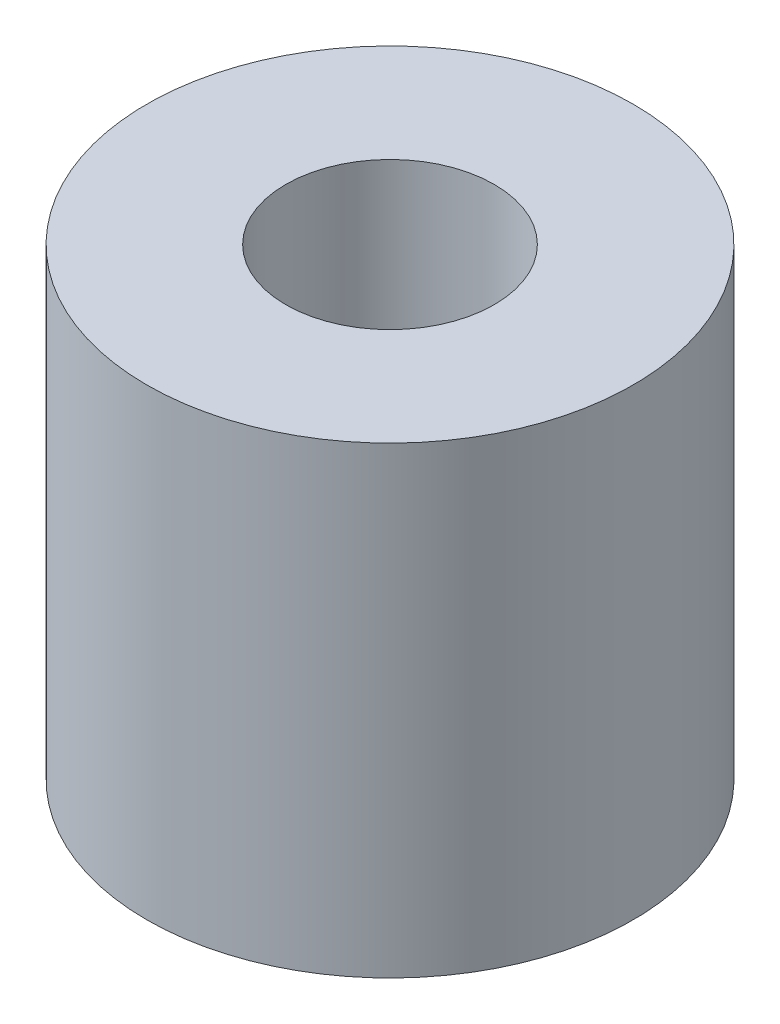
ISO-10303-21;
HEADER;
FILE_DESCRIPTION(('STEP AP214'),'2;1');
FILE_NAME('part.step','',(''),(''),'','','');
FILE_SCHEMA(('AUTOMOTIVE_DESIGN { 1 0 10303 214 1 1 1 1 }'));
ENDSEC;
DATA;
#1=APPLICATION_CONTEXT('core data for automotive mechanical design processes');
#2=APPLICATION_PROTOCOL_DEFINITION('international standard','automotive_design',2000,#1);
#3=PRODUCT_CONTEXT('',#1,'mechanical');
#4=PRODUCT('Part','Part','',(#3));
#5=PRODUCT_RELATED_PRODUCT_CATEGORY('part','',(#4));
#6=PRODUCT_DEFINITION_FORMATION('','',#4);
#7=PRODUCT_DEFINITION_CONTEXT('part definition',#1,'design');
#8=PRODUCT_DEFINITION('design','',#6,#7);
#9=PRODUCT_DEFINITION_SHAPE('','',#8);
#10=(LENGTH_UNIT() NAMED_UNIT(*) SI_UNIT(.MILLI.,.METRE.));
#11=(NAMED_UNIT(*) PLANE_ANGLE_UNIT() SI_UNIT($,.RADIAN.));
#12=(NAMED_UNIT(*) SI_UNIT($,.STERADIAN.) SOLID_ANGLE_UNIT());
#13=UNCERTAINTY_MEASURE_WITH_UNIT(LENGTH_MEASURE(1.E-05),#10,'distance_accuracy_value','');
#14=(GEOMETRIC_REPRESENTATION_CONTEXT(3) GLOBAL_UNCERTAINTY_ASSIGNED_CONTEXT((#13)) GLOBAL_UNIT_ASSIGNED_CONTEXT((#10,
#11,#12)) REPRESENTATION_CONTEXT('',''));
#15=CARTESIAN_POINT('',(0.,0.,0.));
#16=DIRECTION('',(0.,0.,1.));
#17=DIRECTION('',(1.,0.,0.));
#18=AXIS2_PLACEMENT_3D('',#15,#16,#17);
#19=CARTESIAN_POINT('',(0.,40.,0.));
#20=DIRECTION('',(0.,1.,0.));
#21=DIRECTION('',(0.,0.,1.));
#22=AXIS2_PLACEMENT_3D('',#19,#20,#21);
#23=PLANE('',#22);
#24=CARTESIAN_POINT('',(0.,40.,0.));
#25=DIRECTION('',(0.,1.,0.));
#26=DIRECTION('',(0.,0.,1.));
#27=AXIS2_PLACEMENT_3D('',#24,#25,#26);
#28=CIRCLE('',#27,21.);
#29=CARTESIAN_POINT('',(0.,40.,21.));
#30=VERTEX_POINT('',#29);
#31=EDGE_CURVE('E10',#30,#30,#28,.T.);
#32=ORIENTED_EDGE('',*,*,#31,.T.);
#33=EDGE_LOOP('',(#32));
#34=FACE_BOUND('',#33,.T.);
#35=CARTESIAN_POINT('',(0.,40.,0.));
#36=DIRECTION('',(0.,1.,0.));
#37=DIRECTION('',(0.,0.,1.));
#38=AXIS2_PLACEMENT_3D('',#35,#36,#37);
#39=CIRCLE('',#38,9.);
#40=CARTESIAN_POINT('',(0.,40.,9.));
#41=VERTEX_POINT('',#40);
#42=EDGE_CURVE('E50',#41,#41,#39,.T.);
#43=ORIENTED_EDGE('',*,*,#42,.F.);
#44=EDGE_LOOP('',(#43));
#45=FACE_BOUND('',#44,.T.);
#46=ADVANCED_FACE('F37',(#34,#45),#23,.T.);
#47=CARTESIAN_POINT('',(0.,0.,0.));
#48=DIRECTION('',(0.,1.,0.));
#49=DIRECTION('',(0.,0.,1.));
#50=AXIS2_PLACEMENT_3D('',#47,#48,#49);
#51=PLANE('',#50);
#52=CARTESIAN_POINT('',(0.,0.,0.));
#53=DIRECTION('',(0.,1.,0.));
#54=DIRECTION('',(0.,0.,1.));
#55=AXIS2_PLACEMENT_3D('',#52,#53,#54);
#56=CIRCLE('',#55,21.);
#57=CARTESIAN_POINT('',(0.,0.,21.));
#58=VERTEX_POINT('',#57);
#59=EDGE_CURVE('E41',#58,#58,#56,.T.);
#60=ORIENTED_EDGE('',*,*,#59,.F.);
#61=EDGE_LOOP('',(#60));
#62=FACE_BOUND('',#61,.T.);
#63=CARTESIAN_POINT('',(0.,0.,0.));
#64=DIRECTION('',(0.,1.,0.));
#65=DIRECTION('',(0.,0.,1.));
#66=AXIS2_PLACEMENT_3D('',#63,#64,#65);
#67=CIRCLE('',#66,9.);
#68=CARTESIAN_POINT('',(0.,0.,9.));
#69=VERTEX_POINT('',#68);
#70=EDGE_CURVE('E52',#69,#69,#67,.T.);
#71=ORIENTED_EDGE('',*,*,#70,.T.);
#72=EDGE_LOOP('',(#71));
#73=FACE_BOUND('',#72,.T.);
#74=ADVANCED_FACE('F64',(#62,#73),#51,.F.);
#75=CARTESIAN_POINT('',(0.,40.,0.));
#76=DIRECTION('',(0.,-1.,0.));
#77=DIRECTION('',(0.,0.,-1.));
#78=AXIS2_PLACEMENT_3D('',#75,#76,#77);
#79=CYLINDRICAL_SURFACE('',#78,21.);
#80=ORIENTED_EDGE('',*,*,#31,.F.);
#81=EDGE_LOOP('',(#80));
#82=FACE_BOUND('',#81,.T.);
#83=ORIENTED_EDGE('',*,*,#59,.T.);
#84=EDGE_LOOP('',(#83));
#85=FACE_BOUND('',#84,.T.);
#86=ADVANCED_FACE('F39',(#82,#85),#79,.T.);
#87=CARTESIAN_POINT('',(0.,40.,0.));
#88=DIRECTION('',(0.,-1.,0.));
#89=DIRECTION('',(0.,0.,-1.));
#90=AXIS2_PLACEMENT_3D('',#87,#88,#89);
#91=CYLINDRICAL_SURFACE('',#90,9.);
#92=ORIENTED_EDGE('',*,*,#42,.T.);
#93=EDGE_LOOP('',(#92));
#94=FACE_BOUND('',#93,.T.);
#95=ORIENTED_EDGE('',*,*,#70,.F.);
#96=EDGE_LOOP('',(#95));
#97=FACE_BOUND('',#96,.T.);
#98=ADVANCED_FACE('F60',(#94,#97),#91,.F.);
#99=CLOSED_SHELL('',(#46,#74,#86,#98));
#100=MANIFOLD_SOLID_BREP('B2',#99);
#101=ADVANCED_BREP_SHAPE_REPRESENTATION('',(#18,#100),#14);
#102=SHAPE_DEFINITION_REPRESENTATION(#9,#101);
ENDSEC;
END-ISO-10303-21;
